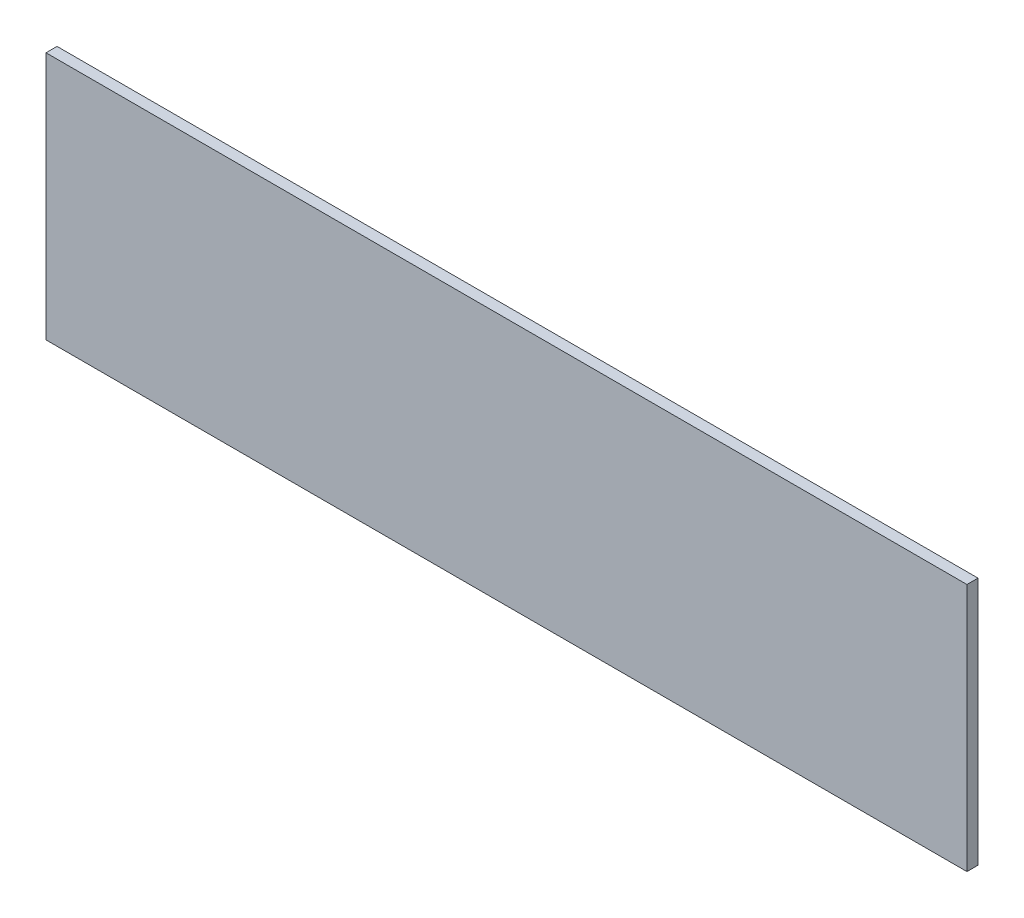
ISO-10303-21;
HEADER;
FILE_DESCRIPTION(('STEP AP214'),'2;1');
FILE_NAME('part.step','',(''),(''),'','','');
FILE_SCHEMA(('AUTOMOTIVE_DESIGN { 1 0 10303 214 1 1 1 1 }'));
ENDSEC;
DATA;
#1=APPLICATION_CONTEXT('core data for automotive mechanical design processes');
#2=APPLICATION_PROTOCOL_DEFINITION('international standard','automotive_design',2000,#1);
#3=PRODUCT_CONTEXT('',#1,'mechanical');
#4=PRODUCT('Part','Part','',(#3));
#5=PRODUCT_RELATED_PRODUCT_CATEGORY('part','',(#4));
#6=PRODUCT_DEFINITION_FORMATION('','',#4);
#7=PRODUCT_DEFINITION_CONTEXT('part definition',#1,'design');
#8=PRODUCT_DEFINITION('design','',#6,#7);
#9=PRODUCT_DEFINITION_SHAPE('','',#8);
#10=(LENGTH_UNIT() NAMED_UNIT(*) SI_UNIT(.MILLI.,.METRE.));
#11=(NAMED_UNIT(*) PLANE_ANGLE_UNIT() SI_UNIT($,.RADIAN.));
#12=(NAMED_UNIT(*) SI_UNIT($,.STERADIAN.) SOLID_ANGLE_UNIT());
#13=UNCERTAINTY_MEASURE_WITH_UNIT(LENGTH_MEASURE(1.E-05),#10,'distance_accuracy_value','');
#14=(GEOMETRIC_REPRESENTATION_CONTEXT(3) GLOBAL_UNCERTAINTY_ASSIGNED_CONTEXT((#13)) GLOBAL_UNIT_ASSIGNED_CONTEXT((#10,
#11,#12)) REPRESENTATION_CONTEXT('',''));
#15=CARTESIAN_POINT('',(0.,0.,0.));
#16=DIRECTION('',(0.,0.,1.));
#17=DIRECTION('',(1.,0.,0.));
#18=AXIS2_PLACEMENT_3D('',#15,#16,#17);
#19=CARTESIAN_POINT('',(0.,0.,6.));
#20=DIRECTION('',(1.,0.,0.));
#21=DIRECTION('',(0.,0.,-1.));
#22=AXIS2_PLACEMENT_3D('',#19,#20,#21);
#23=PLANE('',#22);
#24=DIRECTION('',(0.,-1.,0.));
#25=VECTOR('',#24,1.);
#26=CARTESIAN_POINT('',(0.,0.,0.));
#27=LINE('',#26,#25);
#28=CARTESIAN_POINT('',(0.,135.,0.));
#29=VERTEX_POINT('',#28);
#30=CARTESIAN_POINT('',(0.,0.,0.));
#31=VERTEX_POINT('',#30);
#32=EDGE_CURVE('E96',#29,#31,#27,.T.);
#33=ORIENTED_EDGE('',*,*,#32,.T.);
#34=DIRECTION('',(0.,0.,-1.));
#35=VECTOR('',#34,1.);
#36=CARTESIAN_POINT('',(0.,0.,6.));
#37=LINE('',#36,#35);
#38=CARTESIAN_POINT('',(0.,0.,6.));
#39=VERTEX_POINT('',#38);
#40=EDGE_CURVE('E11',#39,#31,#37,.T.);
#41=ORIENTED_EDGE('',*,*,#40,.F.);
#42=DIRECTION('',(0.,-1.,0.));
#43=VECTOR('',#42,1.);
#44=CARTESIAN_POINT('',(0.,0.,6.));
#45=LINE('',#44,#43);
#46=CARTESIAN_POINT('',(0.,135.,6.));
#47=VERTEX_POINT('',#46);
#48=EDGE_CURVE('E84',#47,#39,#45,.T.);
#49=ORIENTED_EDGE('',*,*,#48,.F.);
#50=DIRECTION('',(0.,0.,-1.));
#51=VECTOR('',#50,1.);
#52=CARTESIAN_POINT('',(0.,135.,6.));
#53=LINE('',#52,#51);
#54=EDGE_CURVE('E92',#47,#29,#53,.T.);
#55=ORIENTED_EDGE('',*,*,#54,.T.);
#56=EDGE_LOOP('',(#33,#41,#49,#55));
#57=FACE_BOUND('',#56,.T.);
#58=ADVANCED_FACE('F33',(#57),#23,.F.);
#59=CARTESIAN_POINT('',(0.,0.,6.));
#60=DIRECTION('',(0.,1.,0.));
#61=DIRECTION('',(0.,0.,1.));
#62=AXIS2_PLACEMENT_3D('',#59,#60,#61);
#63=PLANE('',#62);
#64=DIRECTION('',(1.,0.,0.));
#65=VECTOR('',#64,1.);
#66=CARTESIAN_POINT('',(0.,0.,0.));
#67=LINE('',#66,#65);
#68=CARTESIAN_POINT('',(500.,0.,0.));
#69=VERTEX_POINT('',#68);
#70=EDGE_CURVE('E88',#31,#69,#67,.T.);
#71=ORIENTED_EDGE('',*,*,#70,.T.);
#72=DIRECTION('',(0.,0.,-1.));
#73=VECTOR('',#72,1.);
#74=CARTESIAN_POINT('',(500.,0.,6.));
#75=LINE('',#74,#73);
#76=CARTESIAN_POINT('',(500.,0.,6.));
#77=VERTEX_POINT('',#76);
#78=EDGE_CURVE('E41',#77,#69,#75,.T.);
#79=ORIENTED_EDGE('',*,*,#78,.F.);
#80=DIRECTION('',(1.,0.,0.));
#81=VECTOR('',#80,1.);
#82=CARTESIAN_POINT('',(0.,0.,6.));
#83=LINE('',#82,#81);
#84=EDGE_CURVE('E79',#39,#77,#83,.T.);
#85=ORIENTED_EDGE('',*,*,#84,.F.);
#86=ORIENTED_EDGE('',*,*,#40,.T.);
#87=EDGE_LOOP('',(#71,#79,#85,#86));
#88=FACE_BOUND('',#87,.T.);
#89=ADVANCED_FACE('F87',(#88),#63,.F.);
#90=CARTESIAN_POINT('',(500.,0.,6.));
#91=DIRECTION('',(-1.,0.,0.));
#92=DIRECTION('',(0.,0.,1.));
#93=AXIS2_PLACEMENT_3D('',#90,#91,#92);
#94=PLANE('',#93);
#95=DIRECTION('',(0.,1.,0.));
#96=VECTOR('',#95,1.);
#97=CARTESIAN_POINT('',(500.,0.,0.));
#98=LINE('',#97,#96);
#99=CARTESIAN_POINT('',(500.,135.,0.));
#100=VERTEX_POINT('',#99);
#101=EDGE_CURVE('E66',#69,#100,#98,.T.);
#102=ORIENTED_EDGE('',*,*,#101,.T.);
#103=DIRECTION('',(0.,0.,-1.));
#104=VECTOR('',#103,1.);
#105=CARTESIAN_POINT('',(500.,135.,6.));
#106=LINE('',#105,#104);
#107=CARTESIAN_POINT('',(500.,135.,6.));
#108=VERTEX_POINT('',#107);
#109=EDGE_CURVE('E89',#108,#100,#106,.T.);
#110=ORIENTED_EDGE('',*,*,#109,.F.);
#111=DIRECTION('',(0.,1.,0.));
#112=VECTOR('',#111,1.);
#113=CARTESIAN_POINT('',(500.,0.,6.));
#114=LINE('',#113,#112);
#115=EDGE_CURVE('E82',#77,#108,#114,.T.);
#116=ORIENTED_EDGE('',*,*,#115,.F.);
#117=ORIENTED_EDGE('',*,*,#78,.T.);
#118=EDGE_LOOP('',(#102,#110,#116,#117));
#119=FACE_BOUND('',#118,.T.);
#120=ADVANCED_FACE('F90',(#119),#94,.F.);
#121=CARTESIAN_POINT('',(0.,135.,6.));
#122=DIRECTION('',(0.,-1.,0.));
#123=DIRECTION('',(0.,0.,-1.));
#124=AXIS2_PLACEMENT_3D('',#121,#122,#123);
#125=PLANE('',#124);
#126=DIRECTION('',(-1.,0.,0.));
#127=VECTOR('',#126,1.);
#128=CARTESIAN_POINT('',(0.,135.,0.));
#129=LINE('',#128,#127);
#130=EDGE_CURVE('E72',#100,#29,#129,.T.);
#131=ORIENTED_EDGE('',*,*,#130,.T.);
#132=ORIENTED_EDGE('',*,*,#54,.F.);
#133=DIRECTION('',(-1.,0.,0.));
#134=VECTOR('',#133,1.);
#135=CARTESIAN_POINT('',(0.,135.,6.));
#136=LINE('',#135,#134);
#137=EDGE_CURVE('E49',#108,#47,#136,.T.);
#138=ORIENTED_EDGE('',*,*,#137,.F.);
#139=ORIENTED_EDGE('',*,*,#109,.T.);
#140=EDGE_LOOP('',(#131,#132,#138,#139));
#141=FACE_BOUND('',#140,.T.);
#142=ADVANCED_FACE('F103',(#141),#125,.F.);
#143=CARTESIAN_POINT('',(0.,0.,6.));
#144=DIRECTION('',(0.,0.,-1.));
#145=DIRECTION('',(-1.,0.,0.));
#146=AXIS2_PLACEMENT_3D('',#143,#144,#145);
#147=PLANE('',#146);
#148=ORIENTED_EDGE('',*,*,#48,.T.);
#149=ORIENTED_EDGE('',*,*,#84,.T.);
#150=ORIENTED_EDGE('',*,*,#115,.T.);
#151=ORIENTED_EDGE('',*,*,#137,.T.);
#152=EDGE_LOOP('',(#148,#149,#150,#151));
#153=FACE_BOUND('',#152,.T.);
#154=ADVANCED_FACE('F80',(#153),#147,.F.);
#155=CARTESIAN_POINT('',(0.,0.,0.));
#156=DIRECTION('',(0.,0.,-1.));
#157=DIRECTION('',(-1.,0.,0.));
#158=AXIS2_PLACEMENT_3D('',#155,#156,#157);
#159=PLANE('',#158);
#160=ORIENTED_EDGE('',*,*,#32,.F.);
#161=ORIENTED_EDGE('',*,*,#130,.F.);
#162=ORIENTED_EDGE('',*,*,#101,.F.);
#163=ORIENTED_EDGE('',*,*,#70,.F.);
#164=EDGE_LOOP('',(#160,#161,#162,#163));
#165=FACE_BOUND('',#164,.T.);
#166=ADVANCED_FACE('F106',(#165),#159,.T.);
#167=CLOSED_SHELL('',(#58,#89,#120,#142,#154,#166));
#168=MANIFOLD_SOLID_BREP('B2',#167);
#169=ADVANCED_BREP_SHAPE_REPRESENTATION('',(#18,#168),#14);
#170=SHAPE_DEFINITION_REPRESENTATION(#9,#169);
ENDSEC;
END-ISO-10303-21;
